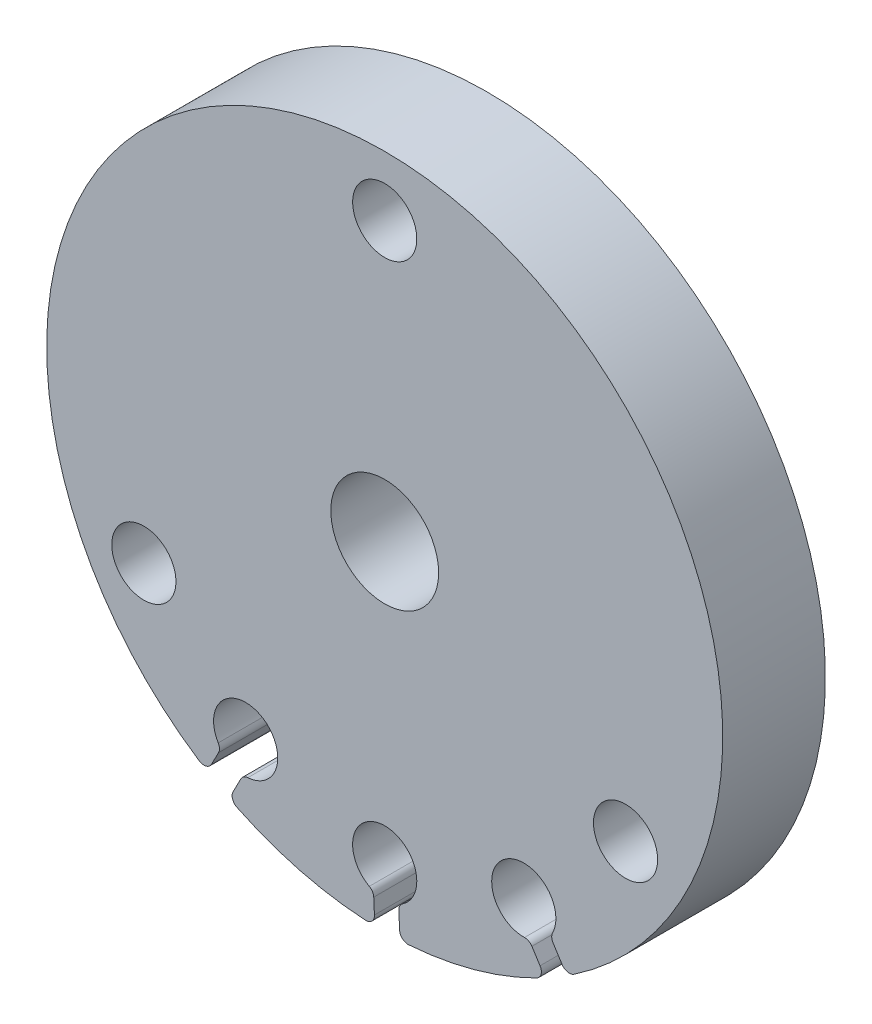
ISO-10303-21;
HEADER;
FILE_DESCRIPTION(('STEP AP214'),'2;1');
FILE_NAME('part.step','',(''),(''),'','','');
FILE_SCHEMA(('AUTOMOTIVE_DESIGN { 1 0 10303 214 1 1 1 1 }'));
ENDSEC;
DATA;
#1=APPLICATION_CONTEXT('core data for automotive mechanical design processes');
#2=APPLICATION_PROTOCOL_DEFINITION('international standard','automotive_design',2000,#1);
#3=PRODUCT_CONTEXT('',#1,'mechanical');
#4=PRODUCT('Part','Part','',(#3));
#5=PRODUCT_RELATED_PRODUCT_CATEGORY('part','',(#4));
#6=PRODUCT_DEFINITION_FORMATION('','',#4);
#7=PRODUCT_DEFINITION_CONTEXT('part definition',#1,'design');
#8=PRODUCT_DEFINITION('design','',#6,#7);
#9=PRODUCT_DEFINITION_SHAPE('','',#8);
#10=(LENGTH_UNIT() NAMED_UNIT(*) SI_UNIT(.MILLI.,.METRE.));
#11=(NAMED_UNIT(*) PLANE_ANGLE_UNIT() SI_UNIT($,.RADIAN.));
#12=(NAMED_UNIT(*) SI_UNIT($,.STERADIAN.) SOLID_ANGLE_UNIT());
#13=UNCERTAINTY_MEASURE_WITH_UNIT(LENGTH_MEASURE(1.E-05),#10,'distance_accuracy_value','');
#14=(GEOMETRIC_REPRESENTATION_CONTEXT(3) GLOBAL_UNCERTAINTY_ASSIGNED_CONTEXT((#13)) GLOBAL_UNIT_ASSIGNED_CONTEXT((#10,
#11,#12)) REPRESENTATION_CONTEXT('',''));
#15=CARTESIAN_POINT('',(0.,0.,0.));
#16=DIRECTION('',(0.,0.,1.));
#17=DIRECTION('',(1.,0.,0.));
#18=AXIS2_PLACEMENT_3D('',#15,#16,#17);
#19=CARTESIAN_POINT('',(0.,0.,6.));
#20=DIRECTION('',(0.,0.,-1.));
#21=DIRECTION('',(-1.,0.,0.));
#22=AXIS2_PLACEMENT_3D('',#19,#20,#21);
#23=CYLINDRICAL_SURFACE('',#22,19.75);
#24=CARTESIAN_POINT('',(0.,0.,6.));
#25=DIRECTION('',(0.,0.,1.));
#26=DIRECTION('',(1.,0.,0.));
#27=AXIS2_PLACEMENT_3D('',#24,#25,#26);
#28=CIRCLE('',#27,19.75);
#29=CARTESIAN_POINT('',(1.40437635482669,-19.7000057627911,6.));
#30=VERTEX_POINT('',#29);
#31=CARTESIAN_POINT('',(8.88046293036666,-17.6408582031143,6.));
#32=VERTEX_POINT('',#31);
#33=EDGE_CURVE('E284',#30,#32,#28,.T.);
#34=ORIENTED_EDGE('',*,*,#33,.F.);
#35=DIRECTION('',(0.,0.,-1.));
#36=VECTOR('',#35,1.);
#37=CARTESIAN_POINT('',(1.40437635482669,-19.7000057627911,6.));
#38=LINE('',#37,#36);
#39=CARTESIAN_POINT('',(1.40437635482669,-19.7000057627911,0.));
#40=VERTEX_POINT('',#39);
#41=EDGE_CURVE('E366',#30,#40,#38,.T.);
#42=ORIENTED_EDGE('',*,*,#41,.T.);
#43=CARTESIAN_POINT('',(0.,0.,0.));
#44=DIRECTION('',(0.,0.,1.));
#45=DIRECTION('',(1.,0.,0.));
#46=AXIS2_PLACEMENT_3D('',#43,#44,#45);
#47=CIRCLE('',#46,19.75);
#48=CARTESIAN_POINT('',(8.88046293036666,-17.6408582031143,0.));
#49=VERTEX_POINT('',#48);
#50=EDGE_CURVE('E277',#40,#49,#47,.T.);
#51=ORIENTED_EDGE('',*,*,#50,.T.);
#52=DIRECTION('',(0.,0.,-1.));
#53=VECTOR('',#52,1.);
#54=CARTESIAN_POINT('',(8.88046293036666,-17.6408582031143,6.));
#55=LINE('',#54,#53);
#56=EDGE_CURVE('E363',#49,#32,#55,.F.);
#57=ORIENTED_EDGE('',*,*,#56,.T.);
#58=EDGE_LOOP('',(#34,#42,#51,#57));
#59=FACE_BOUND('',#58,.T.);
#60=ADVANCED_FACE('F35',(#59),#23,.T.);
#61=CARTESIAN_POINT('',(-8.63377728164147,-17.7628936226903,6.));
#62=VERTEX_POINT('',#61);
#63=CARTESIAN_POINT('',(-1.1297226064935,-19.7176628136394,6.));
#64=VERTEX_POINT('',#63);
#65=EDGE_CURVE('E280',#62,#64,#28,.T.);
#66=ORIENTED_EDGE('',*,*,#65,.F.);
#67=DIRECTION('',(0.,0.,-1.));
#68=VECTOR('',#67,1.);
#69=CARTESIAN_POINT('',(-8.63377728164147,-17.7628936226903,6.));
#70=LINE('',#69,#68);
#71=CARTESIAN_POINT('',(-8.63377728164147,-17.7628936226903,0.));
#72=VERTEX_POINT('',#71);
#73=EDGE_CURVE('E351',#62,#72,#70,.T.);
#74=ORIENTED_EDGE('',*,*,#73,.T.);
#75=CARTESIAN_POINT('',(-1.1297226064935,-19.7176628136394,0.));
#76=VERTEX_POINT('',#75);
#77=EDGE_CURVE('E288',#72,#76,#47,.T.);
#78=ORIENTED_EDGE('',*,*,#77,.T.);
#79=DIRECTION('',(0.,0.,-1.));
#80=VECTOR('',#79,1.);
#81=CARTESIAN_POINT('',(-1.1297226064935,-19.7176628136394,6.));
#82=LINE('',#81,#80);
#83=EDGE_CURVE('E348',#76,#64,#82,.F.);
#84=ORIENTED_EDGE('',*,*,#83,.T.);
#85=EDGE_LOOP('',(#66,#74,#78,#84));
#86=FACE_BOUND('',#85,.T.);
#87=ADVANCED_FACE('F448',(#86),#23,.T.);
#88=CARTESIAN_POINT('',(0.,0.,6.));
#89=DIRECTION('',(0.,0.,1.));
#90=DIRECTION('',(1.,0.,0.));
#91=AXIS2_PLACEMENT_3D('',#88,#89,#90);
#92=PLANE('',#91);
#93=DIRECTION('',(0.460366494256473,0.887728951294259,0.));
#94=VECTOR('',#93,1.);
#95=CARTESIAN_POINT('',(-9.57096055519779,-15.2665723411838,6.));
#96=LINE('',#95,#94);
#97=CARTESIAN_POINT('',(-10.1189759169097,-16.3233154109231,6.));
#98=VERTEX_POINT('',#97);
#99=CARTESIAN_POINT('',(-9.71085417723536,-15.5363305011141,6.));
#100=VERTEX_POINT('',#99);
#101=EDGE_CURVE('E230',#98,#100,#96,.T.);
#102=ORIENTED_EDGE('',*,*,#101,.T.);
#103=CARTESIAN_POINT('',(-10.1547186528825,-15.3061472539858,6.));
#104=DIRECTION('',(0.,0.,1.));
#105=DIRECTION('',(1.,0.,0.));
#106=AXIS2_PLACEMENT_3D('',#103,#104,#105);
#107=CIRCLE('',#106,0.5);
#108=CARTESIAN_POINT('',(-9.72740946280193,-15.046518950304,6.));
#109=VERTEX_POINT('',#108);
#110=EDGE_CURVE('E335',#100,#109,#107,.T.);
#111=ORIENTED_EDGE('',*,*,#110,.T.);
#112=CARTESIAN_POINT('',(-8.12499999999982,-14.0729128114972,6.));
#113=DIRECTION('',(0.,0.,-1.));
#114=DIRECTION('',(-1.,0.,0.));
#115=AXIS2_PLACEMENT_3D('',#112,#113,#114);
#116=CIRCLE('',#115,1.875);
#117=CARTESIAN_POINT('',(-7.99759924504878,-15.9435795502933,6.));
#118=VERTEX_POINT('',#117);
#119=EDGE_CURVE('E218',#109,#118,#116,.T.);
#120=ORIENTED_EDGE('',*,*,#119,.T.);
#121=CARTESIAN_POINT('',(-7.96362571039517,-16.4424240139722,6.));
#122=DIRECTION('',(0.,0.,1.));
#123=DIRECTION('',(1.,0.,0.));
#124=AXIS2_PLACEMENT_3D('',#121,#122,#123);
#125=CIRCLE('',#124,0.5);
#126=CARTESIAN_POINT('',(-8.4074901860423,-16.212240766844,6.));
#127=VERTEX_POINT('',#126);
#128=EDGE_CURVE('E331',#118,#127,#125,.T.);
#129=ORIENTED_EDGE('',*,*,#128,.T.);
#130=DIRECTION('',(-0.460366494256471,-0.88772895129426,0.));
#131=VECTOR('',#130,1.);
#132=CARTESIAN_POINT('',(-9.37153610399585,-18.0712193902267,6.));
#133=LINE('',#132,#131);
#134=CARTESIAN_POINT('',(-8.85906511724705,-17.0830168661269,6.));
#135=VERTEX_POINT('',#134);
#136=EDGE_CURVE('E243',#127,#135,#133,.T.);
#137=ORIENTED_EDGE('',*,*,#136,.T.);
#138=CARTESIAN_POINT('',(-8.41520064159992,-17.3132001132551,6.));
#139=DIRECTION('',(0.,0.,1.));
#140=DIRECTION('',(1.,0.,0.));
#141=AXIS2_PLACEMENT_3D('',#138,#139,#140);
#142=CIRCLE('',#141,0.5);
#143=EDGE_CURVE('E329',#135,#62,#142,.T.);
#144=ORIENTED_EDGE('',*,*,#143,.T.);
#145=ORIENTED_EDGE('',*,*,#65,.T.);
#146=CARTESIAN_POINT('',(-1.1011220341772,-19.2184814765852,6.));
#147=DIRECTION('',(0.,0.,1.));
#148=DIRECTION('',(1.,0.,0.));
#149=AXIS2_PLACEMENT_3D('',#146,#147,#148);
#150=CIRCLE('',#149,0.5);
#151=CARTESIAN_POINT('',(-0.601632498865212,-19.1958937783003,6.));
#152=VERTEX_POINT('',#151);
#153=EDGE_CURVE('E322',#64,#152,#150,.T.);
#154=ORIENTED_EDGE('',*,*,#153,.T.);
#155=DIRECTION('',(-0.0451753965698361,0.998979070623984,0.));
#156=VECTOR('',#155,1.);
#157=CARTESIAN_POINT('',(-0.655408808828178,-18.0067197537769,6.));
#158=LINE('',#157,#156);
#159=CARTESIAN_POINT('',(-0.641681159375001,-18.3102839841736,6.));
#160=VERTEX_POINT('',#159);
#161=EDGE_CURVE('E425',#152,#160,#158,.T.);
#162=ORIENTED_EDGE('',*,*,#161,.T.);
#163=CARTESIAN_POINT('',(-1.14117069468699,-18.3328716824585,6.));
#164=DIRECTION('',(0.,0.,1.));
#165=DIRECTION('',(1.,0.,0.));
#166=AXIS2_PLACEMENT_3D('',#163,#164,#165);
#167=CIRCLE('',#166,0.5);
#168=CARTESIAN_POINT('',(-0.900924232647627,-17.8943723808883,6.));
#169=VERTEX_POINT('',#168);
#170=EDGE_CURVE('E57',#160,#169,#167,.T.);
#171=ORIENTED_EDGE('',*,*,#170,.T.);
#172=CARTESIAN_POINT('',(0.,-16.25,6.));
#173=DIRECTION('',(0.,0.,-1.));
#174=DIRECTION('',(-1.,0.,0.));
#175=AXIS2_PLACEMENT_3D('',#172,#173,#174);
#176=CIRCLE('',#175,1.875);
#177=CARTESIAN_POINT('',(1.04566565964712,-17.8063445403364,6.));
#178=VERTEX_POINT('',#177);
#179=EDGE_CURVE('E428',#169,#178,#176,.T.);
#180=ORIENTED_EDGE('',*,*,#179,.T.);
#181=CARTESIAN_POINT('',(1.32450983555302,-18.2213697510927,6.));
#182=DIRECTION('',(0.,0.,1.));
#183=DIRECTION('',(1.,0.,0.));
#184=AXIS2_PLACEMENT_3D('',#181,#182,#183);
#185=CIRCLE('',#184,0.5);
#186=CARTESIAN_POINT('',(0.825020300241031,-18.2439574493776,6.));
#187=VERTEX_POINT('',#186);
#188=EDGE_CURVE('E327',#178,#187,#185,.T.);
#189=ORIENTED_EDGE('',*,*,#188,.T.);
#190=DIRECTION('',(0.045175396569838,-0.998979070623984,0.));
#191=VECTOR('',#190,1.);
#192=CARTESIAN_POINT('',(0.919621356569918,-20.3359031212962,6.));
#193=LINE('',#192,#191);
#194=CARTESIAN_POINT('',(0.869332987746934,-19.2238591379674,6.));
#195=VERTEX_POINT('',#194);
#196=EDGE_CURVE('E232',#187,#195,#193,.T.);
#197=ORIENTED_EDGE('',*,*,#196,.T.);
#198=CARTESIAN_POINT('',(1.36882252305893,-19.2012714396825,6.));
#199=DIRECTION('',(0.,0.,1.));
#200=DIRECTION('',(1.,0.,0.));
#201=AXIS2_PLACEMENT_3D('',#198,#199,#200);
#202=CIRCLE('',#201,0.5);
#203=EDGE_CURVE('E325',#195,#30,#202,.T.);
#204=ORIENTED_EDGE('',*,*,#203,.T.);
#205=ORIENTED_EDGE('',*,*,#33,.T.);
#206=CARTESIAN_POINT('',(8.65564108402826,-17.1942541979721,6.));
#207=DIRECTION('',(0.,0.,1.));
#208=DIRECTION('',(1.,0.,0.));
#209=AXIS2_PLACEMENT_3D('',#206,#207,#208);
#210=CIRCLE('',#209,0.5);
#211=CARTESIAN_POINT('',(9.07691786139044,-16.9249479097883,6.));
#212=VERTEX_POINT('',#211);
#213=EDGE_CURVE('E318',#32,#212,#210,.T.);
#214=ORIENTED_EDGE('',*,*,#213,.T.);
#215=DIRECTION('',(-0.538612576367593,0.842553554724365,0.));
#216=VECTOR('',#215,1.);
#217=CARTESIAN_POINT('',(8.43575919857897,-15.9219811500121,6.));
#218=LINE('',#217,#216);
#219=CARTESIAN_POINT('',(8.59942980693793,-16.1780116604891,6.));
#220=VERTEX_POINT('',#219);
#221=EDGE_CURVE('E256',#212,#220,#218,.T.);
#222=ORIENTED_EDGE('',*,*,#221,.T.);
#223=CARTESIAN_POINT('',(8.17815302957575,-16.4473179486729,6.));
#224=DIRECTION('',(0.,0.,1.));
#225=DIRECTION('',(1.,0.,0.));
#226=AXIS2_PLACEMENT_3D('',#223,#224,#225);
#227=CIRCLE('',#226,0.5);
#228=CARTESIAN_POINT('',(8.16696291808612,-15.9474431829517,6.));
#229=VERTEX_POINT('',#228);
#230=EDGE_CURVE('E320',#220,#229,#227,.T.);
#231=ORIENTED_EDGE('',*,*,#230,.T.);
#232=CARTESIAN_POINT('',(8.12500000000001,-14.0729128114971,6.));
#233=DIRECTION('',(0.,0.,-1.));
#234=DIRECTION('',(-1.,0.,0.));
#235=AXIS2_PLACEMENT_3D('',#232,#233,#234);
#236=CIRCLE('',#235,1.875);
#237=CARTESIAN_POINT('',(9.80874529528752,-14.8979138906462,6.));
#238=VERTEX_POINT('',#237);
#239=EDGE_CURVE('E259',#229,#238,#236,.T.);
#240=ORIENTED_EDGE('',*,*,#239,.T.);
#241=CARTESIAN_POINT('',(10.2577440406975,-15.1179141784193,6.));
#242=DIRECTION('',(0.,0.,1.));
#243=DIRECTION('',(1.,0.,0.));
#244=AXIS2_PLACEMENT_3D('',#241,#242,#243);
#245=CIRCLE('',#244,0.5);
#246=CARTESIAN_POINT('',(9.83646726333534,-15.3872204666031,6.));
#247=VERTEX_POINT('',#246);
#248=EDGE_CURVE('E316',#238,#247,#245,.T.);
#249=ORIENTED_EDGE('',*,*,#248,.T.);
#250=DIRECTION('',(0.538612576367592,-0.842553554724366,0.));
#251=VECTOR('',#250,1.);
#252=CARTESIAN_POINT('',(10.9643670173004,-17.1515980336568,6.));
#253=LINE('',#252,#251);
#254=CARTESIAN_POINT('',(10.3647940207203,-16.21368387838,6.));
#255=VERTEX_POINT('',#254);
#256=EDGE_CURVE('E263',#247,#255,#253,.T.);
#257=ORIENTED_EDGE('',*,*,#256,.T.);
#258=CARTESIAN_POINT('',(10.7860707980825,-15.9443775901962,6.));
#259=DIRECTION('',(0.,0.,1.));
#260=DIRECTION('',(1.,0.,0.));
#261=AXIS2_PLACEMENT_3D('',#258,#259,#260);
#262=CIRCLE('',#261,0.5);
#263=CARTESIAN_POINT('',(11.0662284811496,-16.3585172678637,6.));
#264=VERTEX_POINT('',#263);
#265=EDGE_CURVE('E314',#255,#264,#262,.T.);
#266=ORIENTED_EDGE('',*,*,#265,.T.);
#267=CARTESIAN_POINT('',(-10.8371998832726,-16.5111355966207,6.));
#268=VERTEX_POINT('',#267);
#269=EDGE_CURVE('E283',#264,#268,#28,.T.);
#270=ORIENTED_EDGE('',*,*,#269,.T.);
#271=CARTESIAN_POINT('',(-10.5628403925569,-16.0931321637949,6.));
#272=DIRECTION('',(0.,0.,1.));
#273=DIRECTION('',(1.,0.,0.));
#274=AXIS2_PLACEMENT_3D('',#271,#272,#273);
#275=CIRCLE('',#274,0.5);
#276=EDGE_CURVE('E333',#268,#98,#275,.T.);
#277=ORIENTED_EDGE('',*,*,#276,.T.);
#278=EDGE_LOOP('',(#102,#111,#120,#129,#137,#144,#145,#154,#162,#171,#180,#189,#197,#204,#205,
#214,#222,#231,#240,#249,#257,#266,#270,#277));
#279=FACE_BOUND('',#278,.T.);
#280=CARTESIAN_POINT('',(-14.072912811497,-8.12500000000017,6.));
#281=DIRECTION('',(0.,0.,-1.));
#282=DIRECTION('',(-1.,0.,0.));
#283=AXIS2_PLACEMENT_3D('',#280,#281,#282);
#284=CIRCLE('',#283,1.875);
#285=CARTESIAN_POINT('',(-15.947912811497,-8.12500000000017,6.));
#286=VERTEX_POINT('',#285);
#287=EDGE_CURVE('E236',#286,#286,#284,.T.);
#288=ORIENTED_EDGE('',*,*,#287,.T.);
#289=EDGE_LOOP('',(#288));
#290=FACE_BOUND('',#289,.T.);
#291=CARTESIAN_POINT('',(-1.13473143512402E-13,16.25,6.));
#292=DIRECTION('',(0.,0.,-1.));
#293=DIRECTION('',(-1.,0.,0.));
#294=AXIS2_PLACEMENT_3D('',#291,#292,#293);
#295=CIRCLE('',#294,1.875);
#296=CARTESIAN_POINT('',(-1.87500000000011,16.25,6.));
#297=VERTEX_POINT('',#296);
#298=EDGE_CURVE('E244',#297,#297,#295,.T.);
#299=ORIENTED_EDGE('',*,*,#298,.T.);
#300=EDGE_LOOP('',(#299));
#301=FACE_BOUND('',#300,.T.);
#302=CARTESIAN_POINT('',(14.0729128114971,-8.12499999999997,6.));
#303=DIRECTION('',(0.,0.,-1.));
#304=DIRECTION('',(-1.,0.,0.));
#305=AXIS2_PLACEMENT_3D('',#302,#303,#304);
#306=CIRCLE('',#305,1.875);
#307=CARTESIAN_POINT('',(12.1979128114971,-8.12499999999997,6.));
#308=VERTEX_POINT('',#307);
#309=EDGE_CURVE('E250',#308,#308,#306,.T.);
#310=ORIENTED_EDGE('',*,*,#309,.T.);
#311=EDGE_LOOP('',(#310));
#312=FACE_BOUND('',#311,.T.);
#313=CARTESIAN_POINT('',(0.,0.,6.));
#314=DIRECTION('',(0.,0.,1.));
#315=DIRECTION('',(1.,0.,0.));
#316=AXIS2_PLACEMENT_3D('',#313,#314,#315);
#317=CIRCLE('',#316,3.15);
#318=CARTESIAN_POINT('',(3.15,0.,6.));
#319=VERTEX_POINT('',#318);
#320=EDGE_CURVE('E274',#319,#319,#317,.T.);
#321=ORIENTED_EDGE('',*,*,#320,.F.);
#322=EDGE_LOOP('',(#321));
#323=FACE_BOUND('',#322,.T.);
#324=ADVANCED_FACE('F390',(#279,#290,#301,#312,#323),#92,.T.);
#325=CARTESIAN_POINT('',(0.,0.,0.));
#326=DIRECTION('',(0.,0.,1.));
#327=DIRECTION('',(1.,0.,0.));
#328=AXIS2_PLACEMENT_3D('',#325,#326,#327);
#329=PLANE('',#328);
#330=CARTESIAN_POINT('',(-14.072912811497,-8.12500000000017,0.));
#331=DIRECTION('',(0.,0.,-1.));
#332=DIRECTION('',(-1.,0.,0.));
#333=AXIS2_PLACEMENT_3D('',#330,#331,#332);
#334=CIRCLE('',#333,1.875);
#335=CARTESIAN_POINT('',(-15.947912811497,-8.12500000000017,0.));
#336=VERTEX_POINT('',#335);
#337=EDGE_CURVE('E240',#336,#336,#334,.T.);
#338=ORIENTED_EDGE('',*,*,#337,.F.);
#339=EDGE_LOOP('',(#338));
#340=FACE_BOUND('',#339,.T.);
#341=CARTESIAN_POINT('',(-1.13473143512402E-13,16.25,0.));
#342=DIRECTION('',(0.,0.,-1.));
#343=DIRECTION('',(-1.,0.,0.));
#344=AXIS2_PLACEMENT_3D('',#341,#342,#343);
#345=CIRCLE('',#344,1.875);
#346=CARTESIAN_POINT('',(-1.87500000000011,16.25,0.));
#347=VERTEX_POINT('',#346);
#348=EDGE_CURVE('E239',#347,#347,#345,.T.);
#349=ORIENTED_EDGE('',*,*,#348,.F.);
#350=EDGE_LOOP('',(#349));
#351=FACE_BOUND('',#350,.T.);
#352=CARTESIAN_POINT('',(14.0729128114971,-8.12499999999997,0.));
#353=DIRECTION('',(0.,0.,-1.));
#354=DIRECTION('',(-1.,0.,0.));
#355=AXIS2_PLACEMENT_3D('',#352,#353,#354);
#356=CIRCLE('',#355,1.875);
#357=CARTESIAN_POINT('',(12.1979128114971,-8.12499999999997,0.));
#358=VERTEX_POINT('',#357);
#359=EDGE_CURVE('E247',#358,#358,#356,.T.);
#360=ORIENTED_EDGE('',*,*,#359,.F.);
#361=EDGE_LOOP('',(#360));
#362=FACE_BOUND('',#361,.T.);
#363=CARTESIAN_POINT('',(-8.12499999999982,-14.0729128114972,0.));
#364=DIRECTION('',(0.,0.,-1.));
#365=DIRECTION('',(-1.,0.,0.));
#366=AXIS2_PLACEMENT_3D('',#363,#364,#365);
#367=CIRCLE('',#366,1.875);
#368=CARTESIAN_POINT('',(-9.72740946280193,-15.046518950304,0.));
#369=VERTEX_POINT('',#368);
#370=CARTESIAN_POINT('',(-7.99759924504878,-15.9435795502933,0.));
#371=VERTEX_POINT('',#370);
#372=EDGE_CURVE('E215',#369,#371,#367,.T.);
#373=ORIENTED_EDGE('',*,*,#372,.F.);
#374=CARTESIAN_POINT('',(-10.1547186528825,-15.3061472539858,0.));
#375=DIRECTION('',(0.,0.,1.));
#376=DIRECTION('',(1.,0.,0.));
#377=AXIS2_PLACEMENT_3D('',#374,#375,#376);
#378=CIRCLE('',#377,0.5);
#379=CARTESIAN_POINT('',(-9.71085417723536,-15.5363305011141,0.));
#380=VERTEX_POINT('',#379);
#381=EDGE_CURVE('E198',#369,#380,#378,.F.);
#382=ORIENTED_EDGE('',*,*,#381,.T.);
#383=DIRECTION('',(0.460366494256473,0.887728951294259,0.));
#384=VECTOR('',#383,1.);
#385=CARTESIAN_POINT('',(-9.57096055519779,-15.2665723411838,0.));
#386=LINE('',#385,#384);
#387=CARTESIAN_POINT('',(-10.1189759169097,-16.3233154109231,0.));
#388=VERTEX_POINT('',#387);
#389=EDGE_CURVE('E227',#388,#380,#386,.T.);
#390=ORIENTED_EDGE('',*,*,#389,.F.);
#391=CARTESIAN_POINT('',(-10.5628403925569,-16.0931321637949,0.));
#392=DIRECTION('',(0.,0.,1.));
#393=DIRECTION('',(1.,0.,0.));
#394=AXIS2_PLACEMENT_3D('',#391,#392,#393);
#395=CIRCLE('',#394,0.5);
#396=CARTESIAN_POINT('',(-10.8371998832726,-16.5111355966207,0.));
#397=VERTEX_POINT('',#396);
#398=EDGE_CURVE('E209',#388,#397,#395,.F.);
#399=ORIENTED_EDGE('',*,*,#398,.T.);
#400=CARTESIAN_POINT('',(11.0662284811496,-16.3585172678637,0.));
#401=VERTEX_POINT('',#400);
#402=EDGE_CURVE('E285',#401,#397,#47,.T.);
#403=ORIENTED_EDGE('',*,*,#402,.F.);
#404=CARTESIAN_POINT('',(10.7860707980825,-15.9443775901962,0.));
#405=DIRECTION('',(0.,0.,1.));
#406=DIRECTION('',(1.,0.,0.));
#407=AXIS2_PLACEMENT_3D('',#404,#405,#406);
#408=CIRCLE('',#407,0.5);
#409=CARTESIAN_POINT('',(10.3647940207203,-16.21368387838,0.));
#410=VERTEX_POINT('',#409);
#411=EDGE_CURVE('E219',#401,#410,#408,.F.);
#412=ORIENTED_EDGE('',*,*,#411,.T.);
#413=DIRECTION('',(0.538612576367592,-0.842553554724366,0.));
#414=VECTOR('',#413,1.);
#415=CARTESIAN_POINT('',(10.9643670173004,-17.1515980336568,0.));
#416=LINE('',#415,#414);
#417=CARTESIAN_POINT('',(9.83646726333534,-15.3872204666031,0.));
#418=VERTEX_POINT('',#417);
#419=EDGE_CURVE('E260',#418,#410,#416,.T.);
#420=ORIENTED_EDGE('',*,*,#419,.F.);
#421=CARTESIAN_POINT('',(10.2577440406975,-15.1179141784193,0.));
#422=DIRECTION('',(0.,0.,1.));
#423=DIRECTION('',(1.,0.,0.));
#424=AXIS2_PLACEMENT_3D('',#421,#422,#423);
#425=CIRCLE('',#424,0.5);
#426=CARTESIAN_POINT('',(9.80874529528752,-14.8979138906462,0.));
#427=VERTEX_POINT('',#426);
#428=EDGE_CURVE('E294',#418,#427,#425,.F.);
#429=ORIENTED_EDGE('',*,*,#428,.T.);
#430=CARTESIAN_POINT('',(8.12500000000001,-14.0729128114971,0.));
#431=DIRECTION('',(0.,0.,-1.));
#432=DIRECTION('',(-1.,0.,0.));
#433=AXIS2_PLACEMENT_3D('',#430,#431,#432);
#434=CIRCLE('',#433,1.875);
#435=CARTESIAN_POINT('',(8.16696291808612,-15.9474431829517,0.));
#436=VERTEX_POINT('',#435);
#437=EDGE_CURVE('E269',#436,#427,#434,.T.);
#438=ORIENTED_EDGE('',*,*,#437,.F.);
#439=CARTESIAN_POINT('',(8.17815302957575,-16.4473179486729,0.));
#440=DIRECTION('',(0.,0.,1.));
#441=DIRECTION('',(1.,0.,0.));
#442=AXIS2_PLACEMENT_3D('',#439,#440,#441);
#443=CIRCLE('',#442,0.5);
#444=CARTESIAN_POINT('',(8.59942980693793,-16.1780116604891,0.));
#445=VERTEX_POINT('',#444);
#446=EDGE_CURVE('E298',#436,#445,#443,.F.);
#447=ORIENTED_EDGE('',*,*,#446,.T.);
#448=DIRECTION('',(-0.538612576367593,0.842553554724365,0.));
#449=VECTOR('',#448,1.);
#450=CARTESIAN_POINT('',(8.43575919857897,-15.9219811500121,0.));
#451=LINE('',#450,#449);
#452=CARTESIAN_POINT('',(9.07691786139044,-16.9249479097883,0.));
#453=VERTEX_POINT('',#452);
#454=EDGE_CURVE('E253',#453,#445,#451,.T.);
#455=ORIENTED_EDGE('',*,*,#454,.F.);
#456=CARTESIAN_POINT('',(8.65564108402826,-17.1942541979721,0.));
#457=DIRECTION('',(0.,0.,1.));
#458=DIRECTION('',(1.,0.,0.));
#459=AXIS2_PLACEMENT_3D('',#456,#457,#458);
#460=CIRCLE('',#459,0.5);
#461=EDGE_CURVE('E296',#453,#49,#460,.F.);
#462=ORIENTED_EDGE('',*,*,#461,.T.);
#463=ORIENTED_EDGE('',*,*,#50,.F.);
#464=CARTESIAN_POINT('',(1.36882252305893,-19.2012714396825,0.));
#465=DIRECTION('',(0.,0.,1.));
#466=DIRECTION('',(1.,0.,0.));
#467=AXIS2_PLACEMENT_3D('',#464,#465,#466);
#468=CIRCLE('',#467,0.5);
#469=CARTESIAN_POINT('',(0.869332987746934,-19.2238591379674,0.));
#470=VERTEX_POINT('',#469);
#471=EDGE_CURVE('E304',#40,#470,#468,.F.);
#472=ORIENTED_EDGE('',*,*,#471,.T.);
#473=DIRECTION('',(0.045175396569838,-0.998979070623984,0.));
#474=VECTOR('',#473,1.);
#475=CARTESIAN_POINT('',(0.919621356569918,-20.3359031212962,0.));
#476=LINE('',#475,#474);
#477=CARTESIAN_POINT('',(0.825020300241031,-18.2439574493776,0.));
#478=VERTEX_POINT('',#477);
#479=EDGE_CURVE('E420',#478,#470,#476,.T.);
#480=ORIENTED_EDGE('',*,*,#479,.F.);
#481=CARTESIAN_POINT('',(1.32450983555302,-18.2213697510927,0.));
#482=DIRECTION('',(0.,0.,1.));
#483=DIRECTION('',(1.,0.,0.));
#484=AXIS2_PLACEMENT_3D('',#481,#482,#483);
#485=CIRCLE('',#484,0.5);
#486=CARTESIAN_POINT('',(1.04566565964712,-17.8063445403364,0.));
#487=VERTEX_POINT('',#486);
#488=EDGE_CURVE('E306',#478,#487,#485,.F.);
#489=ORIENTED_EDGE('',*,*,#488,.T.);
#490=CARTESIAN_POINT('',(0.,-16.25,0.));
#491=DIRECTION('',(0.,0.,-1.));
#492=DIRECTION('',(-1.,0.,0.));
#493=AXIS2_PLACEMENT_3D('',#490,#491,#492);
#494=CIRCLE('',#493,1.875);
#495=CARTESIAN_POINT('',(-0.900924232647627,-17.8943723808883,0.));
#496=VERTEX_POINT('',#495);
#497=EDGE_CURVE('E426',#496,#487,#494,.T.);
#498=ORIENTED_EDGE('',*,*,#497,.F.);
#499=CARTESIAN_POINT('',(-1.14117069468699,-18.3328716824585,0.));
#500=DIRECTION('',(0.,0.,1.));
#501=DIRECTION('',(1.,0.,0.));
#502=AXIS2_PLACEMENT_3D('',#499,#500,#501);
#503=CIRCLE('',#502,0.5);
#504=CARTESIAN_POINT('',(-0.641681159375001,-18.3102839841736,0.));
#505=VERTEX_POINT('',#504);
#506=EDGE_CURVE('E302',#496,#505,#503,.F.);
#507=ORIENTED_EDGE('',*,*,#506,.T.);
#508=DIRECTION('',(0.0451753965698361,-0.998979070623984,0.));
#509=VECTOR('',#508,1.);
#510=CARTESIAN_POINT('',(-1.4667014596142,-0.066326534795411,0.));
#511=LINE('',#510,#509);
#512=CARTESIAN_POINT('',(-0.601632498865212,-19.1958937783003,0.));
#513=VERTEX_POINT('',#512);
#514=EDGE_CURVE('E289',#505,#513,#511,.T.);
#515=ORIENTED_EDGE('',*,*,#514,.T.);
#516=CARTESIAN_POINT('',(-1.1011220341772,-19.2184814765852,0.));
#517=DIRECTION('',(0.,0.,1.));
#518=DIRECTION('',(1.,0.,0.));
#519=AXIS2_PLACEMENT_3D('',#516,#517,#518);
#520=CIRCLE('',#519,0.5);
#521=EDGE_CURVE('E300',#513,#76,#520,.F.);
#522=ORIENTED_EDGE('',*,*,#521,.T.);
#523=ORIENTED_EDGE('',*,*,#77,.F.);
#524=CARTESIAN_POINT('',(-8.41520064159992,-17.3132001132551,0.));
#525=DIRECTION('',(0.,0.,1.));
#526=DIRECTION('',(1.,0.,0.));
#527=AXIS2_PLACEMENT_3D('',#524,#525,#526);
#528=CIRCLE('',#527,0.5);
#529=CARTESIAN_POINT('',(-8.85906511724705,-17.0830168661269,0.));
#530=VERTEX_POINT('',#529);
#531=EDGE_CURVE('E308',#72,#530,#528,.F.);
#532=ORIENTED_EDGE('',*,*,#531,.T.);
#533=DIRECTION('',(-0.460366494256471,-0.88772895129426,0.));
#534=VECTOR('',#533,1.);
#535=CARTESIAN_POINT('',(-9.37153610399585,-18.0712193902267,0.));
#536=LINE('',#535,#534);
#537=CARTESIAN_POINT('',(-8.4074901860423,-16.212240766844,0.));
#538=VERTEX_POINT('',#537);
#539=EDGE_CURVE('E226',#538,#530,#536,.T.);
#540=ORIENTED_EDGE('',*,*,#539,.F.);
#541=CARTESIAN_POINT('',(-7.96362571039517,-16.4424240139722,0.));
#542=DIRECTION('',(0.,0.,1.));
#543=DIRECTION('',(1.,0.,0.));
#544=AXIS2_PLACEMENT_3D('',#541,#542,#543);
#545=CIRCLE('',#544,0.5);
#546=EDGE_CURVE('E225',#538,#371,#545,.F.);
#547=ORIENTED_EDGE('',*,*,#546,.T.);
#548=EDGE_LOOP('',(#373,#382,#390,#399,#403,#412,#420,#429,#438,#447,#455,#462,#463,#472,#480,
#489,#498,#507,#515,#522,#523,#532,#540,#547));
#549=FACE_BOUND('',#548,.T.);
#550=CARTESIAN_POINT('',(0.,0.,0.));
#551=DIRECTION('',(0.,0.,1.));
#552=DIRECTION('',(1.,0.,0.));
#553=AXIS2_PLACEMENT_3D('',#550,#551,#552);
#554=CIRCLE('',#553,3.15);
#555=CARTESIAN_POINT('',(3.15,0.,0.));
#556=VERTEX_POINT('',#555);
#557=EDGE_CURVE('E266',#556,#556,#554,.T.);
#558=ORIENTED_EDGE('',*,*,#557,.T.);
#559=EDGE_LOOP('',(#558));
#560=FACE_BOUND('',#559,.T.);
#561=ADVANCED_FACE('F222',(#340,#351,#362,#549,#560),#329,.F.);
#562=ORIENTED_EDGE('',*,*,#402,.T.);
#563=DIRECTION('',(0.,0.,-1.));
#564=VECTOR('',#563,1.);
#565=CARTESIAN_POINT('',(-10.8371998832726,-16.5111355966207,6.));
#566=LINE('',#565,#564);
#567=EDGE_CURVE('E340',#397,#268,#566,.F.);
#568=ORIENTED_EDGE('',*,*,#567,.T.);
#569=ORIENTED_EDGE('',*,*,#269,.F.);
#570=DIRECTION('',(0.,0.,-1.));
#571=VECTOR('',#570,1.);
#572=CARTESIAN_POINT('',(11.0662284811496,-16.3585172678637,6.));
#573=LINE('',#572,#571);
#574=EDGE_CURVE('E337',#264,#401,#573,.T.);
#575=ORIENTED_EDGE('',*,*,#574,.T.);
#576=EDGE_LOOP('',(#562,#568,#569,#575));
#577=FACE_BOUND('',#576,.T.);
#578=ADVANCED_FACE('F398',(#577),#23,.T.);
#579=CARTESIAN_POINT('',(0.,0.,6.));
#580=DIRECTION('',(0.,0.,-1.));
#581=DIRECTION('',(-1.,0.,0.));
#582=AXIS2_PLACEMENT_3D('',#579,#580,#581);
#583=CYLINDRICAL_SURFACE('',#582,3.15);
#584=ORIENTED_EDGE('',*,*,#320,.T.);
#585=EDGE_LOOP('',(#584));
#586=FACE_BOUND('',#585,.T.);
#587=ORIENTED_EDGE('',*,*,#557,.F.);
#588=EDGE_LOOP('',(#587));
#589=FACE_BOUND('',#588,.T.);
#590=ADVANCED_FACE('F484',(#586,#589),#583,.F.);
#591=CARTESIAN_POINT('',(10.9643670173004,-17.1515980336568,6.));
#592=DIRECTION('',(0.842553554724366,0.538612576367592,0.));
#593=DIRECTION('',(-0.538612576367592,0.842553554724366,0.));
#594=AXIS2_PLACEMENT_3D('',#591,#592,#593);
#595=PLANE('',#594);
#596=ORIENTED_EDGE('',*,*,#256,.F.);
#597=DIRECTION('',(0.,0.,-1.));
#598=VECTOR('',#597,1.);
#599=CARTESIAN_POINT('',(9.83646726333534,-15.3872204666031,6.));
#600=LINE('',#599,#598);
#601=EDGE_CURVE('E11',#247,#418,#600,.T.);
#602=ORIENTED_EDGE('',*,*,#601,.T.);
#603=ORIENTED_EDGE('',*,*,#419,.T.);
#604=DIRECTION('',(0.,0.,-1.));
#605=VECTOR('',#604,1.);
#606=CARTESIAN_POINT('',(10.3647940207203,-16.21368387838,6.));
#607=LINE('',#606,#605);
#608=EDGE_CURVE('E43',#410,#255,#607,.F.);
#609=ORIENTED_EDGE('',*,*,#608,.T.);
#610=EDGE_LOOP('',(#596,#602,#603,#609));
#611=FACE_BOUND('',#610,.T.);
#612=ADVANCED_FACE('F384',(#611),#595,.F.);
#613=CARTESIAN_POINT('',(8.43575919857897,-15.9219811500121,6.));
#614=DIRECTION('',(-0.842553554724365,-0.538612576367593,0.));
#615=DIRECTION('',(0.538612576367593,-0.842553554724366,0.));
#616=AXIS2_PLACEMENT_3D('',#613,#614,#615);
#617=PLANE('',#616);
#618=ORIENTED_EDGE('',*,*,#454,.T.);
#619=DIRECTION('',(0.,0.,-1.));
#620=VECTOR('',#619,1.);
#621=CARTESIAN_POINT('',(8.59942980693793,-16.1780116604891,6.));
#622=LINE('',#621,#620);
#623=EDGE_CURVE('E380',#445,#220,#622,.F.);
#624=ORIENTED_EDGE('',*,*,#623,.T.);
#625=ORIENTED_EDGE('',*,*,#221,.F.);
#626=DIRECTION('',(0.,0.,-1.));
#627=VECTOR('',#626,1.);
#628=CARTESIAN_POINT('',(9.07691786139044,-16.9249479097883,6.));
#629=LINE('',#628,#627);
#630=EDGE_CURVE('E378',#212,#453,#629,.T.);
#631=ORIENTED_EDGE('',*,*,#630,.T.);
#632=EDGE_LOOP('',(#618,#624,#625,#631));
#633=FACE_BOUND('',#632,.T.);
#634=ADVANCED_FACE('F457',(#633),#617,.F.);
#635=CARTESIAN_POINT('',(8.12500000000001,-14.0729128114971,6.));
#636=DIRECTION('',(0.,0.,-1.));
#637=DIRECTION('',(-1.,0.,0.));
#638=AXIS2_PLACEMENT_3D('',#635,#636,#637);
#639=CYLINDRICAL_SURFACE('',#638,1.875);
#640=ORIENTED_EDGE('',*,*,#239,.F.);
#641=DIRECTION('',(0.,0.,-1.));
#642=VECTOR('',#641,1.);
#643=CARTESIAN_POINT('',(8.16696291808612,-15.9474431829517,6.));
#644=LINE('',#643,#642);
#645=EDGE_CURVE('E375',#229,#436,#644,.T.);
#646=ORIENTED_EDGE('',*,*,#645,.T.);
#647=ORIENTED_EDGE('',*,*,#437,.T.);
#648=DIRECTION('',(0.,0.,-1.));
#649=VECTOR('',#648,1.);
#650=CARTESIAN_POINT('',(9.80874529528752,-14.8979138906462,6.));
#651=LINE('',#650,#649);
#652=EDGE_CURVE('E373',#427,#238,#651,.F.);
#653=ORIENTED_EDGE('',*,*,#652,.T.);
#654=EDGE_LOOP('',(#640,#646,#647,#653));
#655=FACE_BOUND('',#654,.T.);
#656=ADVANCED_FACE('F466',(#655),#639,.F.);
#657=CARTESIAN_POINT('',(14.0729128114971,-8.12499999999997,6.));
#658=DIRECTION('',(0.,0.,-1.));
#659=DIRECTION('',(-1.,0.,0.));
#660=AXIS2_PLACEMENT_3D('',#657,#658,#659);
#661=CYLINDRICAL_SURFACE('',#660,1.875);
#662=ORIENTED_EDGE('',*,*,#309,.F.);
#663=EDGE_LOOP('',(#662));
#664=FACE_BOUND('',#663,.T.);
#665=ORIENTED_EDGE('',*,*,#359,.T.);
#666=EDGE_LOOP('',(#665));
#667=FACE_BOUND('',#666,.T.);
#668=ADVANCED_FACE('F503',(#664,#667),#661,.F.);
#669=CARTESIAN_POINT('',(-1.13473143512402E-13,16.25,6.));
#670=DIRECTION('',(0.,0.,-1.));
#671=DIRECTION('',(-1.,0.,0.));
#672=AXIS2_PLACEMENT_3D('',#669,#670,#671);
#673=CYLINDRICAL_SURFACE('',#672,1.875);
#674=ORIENTED_EDGE('',*,*,#298,.F.);
#675=EDGE_LOOP('',(#674));
#676=FACE_BOUND('',#675,.T.);
#677=ORIENTED_EDGE('',*,*,#348,.T.);
#678=EDGE_LOOP('',(#677));
#679=FACE_BOUND('',#678,.T.);
#680=ADVANCED_FACE('F508',(#676,#679),#673,.F.);
#681=CARTESIAN_POINT('',(-14.072912811497,-8.12500000000017,6.));
#682=DIRECTION('',(0.,0.,-1.));
#683=DIRECTION('',(-1.,0.,0.));
#684=AXIS2_PLACEMENT_3D('',#681,#682,#683);
#685=CYLINDRICAL_SURFACE('',#684,1.875);
#686=ORIENTED_EDGE('',*,*,#287,.F.);
#687=EDGE_LOOP('',(#686));
#688=FACE_BOUND('',#687,.T.);
#689=ORIENTED_EDGE('',*,*,#337,.T.);
#690=EDGE_LOOP('',(#689));
#691=FACE_BOUND('',#690,.T.);
#692=ADVANCED_FACE('F512',(#688,#691),#685,.F.);
#693=CARTESIAN_POINT('',(-9.37153610399585,-18.0712193902267,6.));
#694=DIRECTION('',(0.88772895129426,-0.460366494256471,0.));
#695=DIRECTION('',(0.460366494256471,0.88772895129426,0.));
#696=AXIS2_PLACEMENT_3D('',#693,#694,#695);
#697=PLANE('',#696);
#698=ORIENTED_EDGE('',*,*,#136,.F.);
#699=DIRECTION('',(0.,0.,-1.));
#700=VECTOR('',#699,1.);
#701=CARTESIAN_POINT('',(-8.4074901860423,-16.212240766844,6.));
#702=LINE('',#701,#700);
#703=EDGE_CURVE('E345',#127,#538,#702,.T.);
#704=ORIENTED_EDGE('',*,*,#703,.T.);
#705=ORIENTED_EDGE('',*,*,#539,.T.);
#706=DIRECTION('',(0.,0.,-1.));
#707=VECTOR('',#706,1.);
#708=CARTESIAN_POINT('',(-8.85906511724705,-17.0830168661269,6.));
#709=LINE('',#708,#707);
#710=EDGE_CURVE('E343',#530,#135,#709,.F.);
#711=ORIENTED_EDGE('',*,*,#710,.T.);
#712=EDGE_LOOP('',(#698,#704,#705,#711));
#713=FACE_BOUND('',#712,.T.);
#714=ADVANCED_FACE('F516',(#713),#697,.F.);
#715=CARTESIAN_POINT('',(-9.57096055519779,-15.2665723411838,6.));
#716=DIRECTION('',(-0.887728951294259,0.460366494256473,0.));
#717=DIRECTION('',(-0.460366494256473,-0.887728951294259,0.));
#718=AXIS2_PLACEMENT_3D('',#715,#716,#717);
#719=PLANE('',#718);
#720=ORIENTED_EDGE('',*,*,#389,.T.);
#721=DIRECTION('',(0.,0.,-1.));
#722=VECTOR('',#721,1.);
#723=CARTESIAN_POINT('',(-9.71085417723536,-15.5363305011141,6.));
#724=LINE('',#723,#722);
#725=EDGE_CURVE('E203',#380,#100,#724,.F.);
#726=ORIENTED_EDGE('',*,*,#725,.T.);
#727=ORIENTED_EDGE('',*,*,#101,.F.);
#728=DIRECTION('',(0.,0.,-1.));
#729=VECTOR('',#728,1.);
#730=CARTESIAN_POINT('',(-10.1189759169097,-16.3233154109231,6.));
#731=LINE('',#730,#729);
#732=EDGE_CURVE('E208',#98,#388,#731,.T.);
#733=ORIENTED_EDGE('',*,*,#732,.T.);
#734=EDGE_LOOP('',(#720,#726,#727,#733));
#735=FACE_BOUND('',#734,.T.);
#736=ADVANCED_FACE('F518',(#735),#719,.F.);
#737=CARTESIAN_POINT('',(-8.12499999999982,-14.0729128114972,6.));
#738=DIRECTION('',(0.,0.,-1.));
#739=DIRECTION('',(-1.,0.,0.));
#740=AXIS2_PLACEMENT_3D('',#737,#738,#739);
#741=CYLINDRICAL_SURFACE('',#740,1.875);
#742=ORIENTED_EDGE('',*,*,#119,.F.);
#743=DIRECTION('',(0.,0.,-1.));
#744=VECTOR('',#743,1.);
#745=CARTESIAN_POINT('',(-9.72740946280193,-15.046518950304,6.));
#746=LINE('',#745,#744);
#747=EDGE_CURVE('E202',#109,#369,#746,.T.);
#748=ORIENTED_EDGE('',*,*,#747,.T.);
#749=ORIENTED_EDGE('',*,*,#372,.T.);
#750=DIRECTION('',(0.,0.,-1.));
#751=VECTOR('',#750,1.);
#752=CARTESIAN_POINT('',(-7.99759924504878,-15.9435795502933,6.));
#753=LINE('',#752,#751);
#754=EDGE_CURVE('E220',#371,#118,#753,.F.);
#755=ORIENTED_EDGE('',*,*,#754,.T.);
#756=EDGE_LOOP('',(#742,#748,#749,#755));
#757=FACE_BOUND('',#756,.T.);
#758=ADVANCED_FACE('F214',(#757),#741,.F.);
#759=CARTESIAN_POINT('',(0.919621356569918,-20.3359031212962,6.));
#760=DIRECTION('',(0.998979070623984,0.045175396569838,0.));
#761=DIRECTION('',(-0.045175396569838,0.998979070623984,0.));
#762=AXIS2_PLACEMENT_3D('',#759,#760,#761);
#763=PLANE('',#762);
#764=ORIENTED_EDGE('',*,*,#196,.F.);
#765=DIRECTION('',(0.,0.,-1.));
#766=VECTOR('',#765,1.);
#767=CARTESIAN_POINT('',(0.825020300241031,-18.2439574493776,6.));
#768=LINE('',#767,#766);
#769=EDGE_CURVE('E356',#187,#478,#768,.T.);
#770=ORIENTED_EDGE('',*,*,#769,.T.);
#771=ORIENTED_EDGE('',*,*,#479,.T.);
#772=DIRECTION('',(0.,0.,-1.));
#773=VECTOR('',#772,1.);
#774=CARTESIAN_POINT('',(0.869332987746934,-19.2238591379674,6.));
#775=LINE('',#774,#773);
#776=EDGE_CURVE('E354',#470,#195,#775,.F.);
#777=ORIENTED_EDGE('',*,*,#776,.T.);
#778=EDGE_LOOP('',(#764,#770,#771,#777));
#779=FACE_BOUND('',#778,.T.);
#780=ADVANCED_FACE('F423',(#779),#763,.F.);
#781=CARTESIAN_POINT('',(-0.655408808828178,-18.0067197537769,6.));
#782=DIRECTION('',(-0.998979070623984,-0.0451753965698361,0.));
#783=DIRECTION('',(0.0451753965698361,-0.998979070623984,0.));
#784=AXIS2_PLACEMENT_3D('',#781,#782,#783);
#785=PLANE('',#784);
#786=ORIENTED_EDGE('',*,*,#514,.F.);
#787=DIRECTION('',(0.,0.,-1.));
#788=VECTOR('',#787,1.);
#789=CARTESIAN_POINT('',(-0.641681159375001,-18.3102839841736,6.));
#790=LINE('',#789,#788);
#791=EDGE_CURVE('E371',#505,#160,#790,.F.);
#792=ORIENTED_EDGE('',*,*,#791,.T.);
#793=ORIENTED_EDGE('',*,*,#161,.F.);
#794=DIRECTION('',(0.,0.,-1.));
#795=VECTOR('',#794,1.);
#796=CARTESIAN_POINT('',(-0.601632498865212,-19.1958937783003,6.));
#797=LINE('',#796,#795);
#798=EDGE_CURVE('E369',#152,#513,#797,.T.);
#799=ORIENTED_EDGE('',*,*,#798,.T.);
#800=EDGE_LOOP('',(#786,#792,#793,#799));
#801=FACE_BOUND('',#800,.T.);
#802=ADVANCED_FACE('F526',(#801),#785,.F.);
#803=CARTESIAN_POINT('',(0.,-16.25,6.));
#804=DIRECTION('',(0.,0.,-1.));
#805=DIRECTION('',(-1.,0.,0.));
#806=AXIS2_PLACEMENT_3D('',#803,#804,#805);
#807=CYLINDRICAL_SURFACE('',#806,1.875);
#808=ORIENTED_EDGE('',*,*,#497,.T.);
#809=DIRECTION('',(0.,0.,-1.));
#810=VECTOR('',#809,1.);
#811=CARTESIAN_POINT('',(1.04566565964712,-17.8063445403364,6.));
#812=LINE('',#811,#810);
#813=EDGE_CURVE('E50',#487,#178,#812,.F.);
#814=ORIENTED_EDGE('',*,*,#813,.T.);
#815=ORIENTED_EDGE('',*,*,#179,.F.);
#816=DIRECTION('',(0.,0.,-1.));
#817=VECTOR('',#816,1.);
#818=CARTESIAN_POINT('',(-0.900924232647627,-17.8943723808883,6.));
#819=LINE('',#818,#817);
#820=EDGE_CURVE('E359',#169,#496,#819,.T.);
#821=ORIENTED_EDGE('',*,*,#820,.T.);
#822=EDGE_LOOP('',(#808,#814,#815,#821));
#823=FACE_BOUND('',#822,.T.);
#824=ADVANCED_FACE('F529',(#823),#807,.F.);
#825=CARTESIAN_POINT('',(-10.1547186528825,-15.3061472539858,6.));
#826=DIRECTION('',(0.,0.,-1.));
#827=DIRECTION('',(-1.,0.,0.));
#828=AXIS2_PLACEMENT_3D('',#825,#826,#827);
#829=CYLINDRICAL_SURFACE('',#828,0.5);
#830=ORIENTED_EDGE('',*,*,#110,.F.);
#831=ORIENTED_EDGE('',*,*,#725,.F.);
#832=ORIENTED_EDGE('',*,*,#381,.F.);
#833=ORIENTED_EDGE('',*,*,#747,.F.);
#834=EDGE_LOOP('',(#830,#831,#832,#833));
#835=FACE_BOUND('',#834,.T.);
#836=ADVANCED_FACE('F201',(#835),#829,.T.);
#837=CARTESIAN_POINT('',(-10.5628403925569,-16.0931321637949,6.));
#838=DIRECTION('',(0.,0.,-1.));
#839=DIRECTION('',(-1.,0.,0.));
#840=AXIS2_PLACEMENT_3D('',#837,#838,#839);
#841=CYLINDRICAL_SURFACE('',#840,0.5);
#842=ORIENTED_EDGE('',*,*,#398,.F.);
#843=ORIENTED_EDGE('',*,*,#732,.F.);
#844=ORIENTED_EDGE('',*,*,#276,.F.);
#845=ORIENTED_EDGE('',*,*,#567,.F.);
#846=EDGE_LOOP('',(#842,#843,#844,#845));
#847=FACE_BOUND('',#846,.T.);
#848=ADVANCED_FACE('F403',(#847),#841,.T.);
#849=CARTESIAN_POINT('',(-7.96362571039517,-16.4424240139722,6.));
#850=DIRECTION('',(0.,0.,-1.));
#851=DIRECTION('',(-1.,0.,0.));
#852=AXIS2_PLACEMENT_3D('',#849,#850,#851);
#853=CYLINDRICAL_SURFACE('',#852,0.5);
#854=ORIENTED_EDGE('',*,*,#128,.F.);
#855=ORIENTED_EDGE('',*,*,#754,.F.);
#856=ORIENTED_EDGE('',*,*,#546,.F.);
#857=ORIENTED_EDGE('',*,*,#703,.F.);
#858=EDGE_LOOP('',(#854,#855,#856,#857));
#859=FACE_BOUND('',#858,.T.);
#860=ADVANCED_FACE('F557',(#859),#853,.T.);
#861=CARTESIAN_POINT('',(-8.41520064159992,-17.3132001132551,6.));
#862=DIRECTION('',(0.,0.,-1.));
#863=DIRECTION('',(-1.,0.,0.));
#864=AXIS2_PLACEMENT_3D('',#861,#862,#863);
#865=CYLINDRICAL_SURFACE('',#864,0.5);
#866=ORIENTED_EDGE('',*,*,#143,.F.);
#867=ORIENTED_EDGE('',*,*,#710,.F.);
#868=ORIENTED_EDGE('',*,*,#531,.F.);
#869=ORIENTED_EDGE('',*,*,#73,.F.);
#870=EDGE_LOOP('',(#866,#867,#868,#869));
#871=FACE_BOUND('',#870,.T.);
#872=ADVANCED_FACE('F444',(#871),#865,.T.);
#873=CARTESIAN_POINT('',(1.32450983555302,-18.2213697510927,6.));
#874=DIRECTION('',(0.,0.,-1.));
#875=DIRECTION('',(-1.,0.,0.));
#876=AXIS2_PLACEMENT_3D('',#873,#874,#875);
#877=CYLINDRICAL_SURFACE('',#876,0.5);
#878=ORIENTED_EDGE('',*,*,#188,.F.);
#879=ORIENTED_EDGE('',*,*,#813,.F.);
#880=ORIENTED_EDGE('',*,*,#488,.F.);
#881=ORIENTED_EDGE('',*,*,#769,.F.);
#882=EDGE_LOOP('',(#878,#879,#880,#881));
#883=FACE_BOUND('',#882,.T.);
#884=ADVANCED_FACE('F571',(#883),#877,.T.);
#885=CARTESIAN_POINT('',(1.36882252305893,-19.2012714396825,6.));
#886=DIRECTION('',(0.,0.,-1.));
#887=DIRECTION('',(-1.,0.,0.));
#888=AXIS2_PLACEMENT_3D('',#885,#886,#887);
#889=CYLINDRICAL_SURFACE('',#888,0.5);
#890=ORIENTED_EDGE('',*,*,#203,.F.);
#891=ORIENTED_EDGE('',*,*,#776,.F.);
#892=ORIENTED_EDGE('',*,*,#471,.F.);
#893=ORIENTED_EDGE('',*,*,#41,.F.);
#894=EDGE_LOOP('',(#890,#891,#892,#893));
#895=FACE_BOUND('',#894,.T.);
#896=ADVANCED_FACE('F416',(#895),#889,.T.);
#897=CARTESIAN_POINT('',(-1.14117069468699,-18.3328716824585,6.));
#898=DIRECTION('',(0.,0.,-1.));
#899=DIRECTION('',(-1.,0.,0.));
#900=AXIS2_PLACEMENT_3D('',#897,#898,#899);
#901=CYLINDRICAL_SURFACE('',#900,0.5);
#902=ORIENTED_EDGE('',*,*,#170,.F.);
#903=ORIENTED_EDGE('',*,*,#791,.F.);
#904=ORIENTED_EDGE('',*,*,#506,.F.);
#905=ORIENTED_EDGE('',*,*,#820,.F.);
#906=EDGE_LOOP('',(#902,#903,#904,#905));
#907=FACE_BOUND('',#906,.T.);
#908=ADVANCED_FACE('F585',(#907),#901,.T.);
#909=CARTESIAN_POINT('',(-1.1011220341772,-19.2184814765852,6.));
#910=DIRECTION('',(0.,0.,-1.));
#911=DIRECTION('',(-1.,0.,0.));
#912=AXIS2_PLACEMENT_3D('',#909,#910,#911);
#913=CYLINDRICAL_SURFACE('',#912,0.5);
#914=ORIENTED_EDGE('',*,*,#521,.F.);
#915=ORIENTED_EDGE('',*,*,#798,.F.);
#916=ORIENTED_EDGE('',*,*,#153,.F.);
#917=ORIENTED_EDGE('',*,*,#83,.F.);
#918=EDGE_LOOP('',(#914,#915,#916,#917));
#919=FACE_BOUND('',#918,.T.);
#920=ADVANCED_FACE('F592',(#919),#913,.T.);
#921=CARTESIAN_POINT('',(8.17815302957575,-16.4473179486729,6.));
#922=DIRECTION('',(0.,0.,-1.));
#923=DIRECTION('',(-1.,0.,0.));
#924=AXIS2_PLACEMENT_3D('',#921,#922,#923);
#925=CYLINDRICAL_SURFACE('',#924,0.5);
#926=ORIENTED_EDGE('',*,*,#230,.F.);
#927=ORIENTED_EDGE('',*,*,#623,.F.);
#928=ORIENTED_EDGE('',*,*,#446,.F.);
#929=ORIENTED_EDGE('',*,*,#645,.F.);
#930=EDGE_LOOP('',(#926,#927,#928,#929));
#931=FACE_BOUND('',#930,.T.);
#932=ADVANCED_FACE('F463',(#931),#925,.T.);
#933=CARTESIAN_POINT('',(8.65564108402826,-17.1942541979721,6.));
#934=DIRECTION('',(0.,0.,-1.));
#935=DIRECTION('',(-1.,0.,0.));
#936=AXIS2_PLACEMENT_3D('',#933,#934,#935);
#937=CYLINDRICAL_SURFACE('',#936,0.5);
#938=ORIENTED_EDGE('',*,*,#461,.F.);
#939=ORIENTED_EDGE('',*,*,#630,.F.);
#940=ORIENTED_EDGE('',*,*,#213,.F.);
#941=ORIENTED_EDGE('',*,*,#56,.F.);
#942=EDGE_LOOP('',(#938,#939,#940,#941));
#943=FACE_BOUND('',#942,.T.);
#944=ADVANCED_FACE('F453',(#943),#937,.T.);
#945=CARTESIAN_POINT('',(10.2577440406975,-15.1179141784193,6.));
#946=DIRECTION('',(0.,0.,-1.));
#947=DIRECTION('',(-1.,0.,0.));
#948=AXIS2_PLACEMENT_3D('',#945,#946,#947);
#949=CYLINDRICAL_SURFACE('',#948,0.5);
#950=ORIENTED_EDGE('',*,*,#248,.F.);
#951=ORIENTED_EDGE('',*,*,#652,.F.);
#952=ORIENTED_EDGE('',*,*,#428,.F.);
#953=ORIENTED_EDGE('',*,*,#601,.F.);
#954=EDGE_LOOP('',(#950,#951,#952,#953));
#955=FACE_BOUND('',#954,.T.);
#956=ADVANCED_FACE('F469',(#955),#949,.T.);
#957=CARTESIAN_POINT('',(10.7860707980825,-15.9443775901962,6.));
#958=DIRECTION('',(0.,0.,-1.));
#959=DIRECTION('',(-1.,0.,0.));
#960=AXIS2_PLACEMENT_3D('',#957,#958,#959);
#961=CYLINDRICAL_SURFACE('',#960,0.5);
#962=ORIENTED_EDGE('',*,*,#265,.F.);
#963=ORIENTED_EDGE('',*,*,#608,.F.);
#964=ORIENTED_EDGE('',*,*,#411,.F.);
#965=ORIENTED_EDGE('',*,*,#574,.F.);
#966=EDGE_LOOP('',(#962,#963,#964,#965));
#967=FACE_BOUND('',#966,.T.);
#968=ADVANCED_FACE('F37',(#967),#961,.T.);
#969=CLOSED_SHELL('',(#60,#87,#324,#561,#578,#590,#612,#634,#656,#668,#680,#692,#714,#736,#758,
#780,#802,#824,#836,#848,#860,#872,#884,#896,#908,#920,#932,#944,#956,#968));
#970=MANIFOLD_SOLID_BREP('B2',#969);
#971=ADVANCED_BREP_SHAPE_REPRESENTATION('',(#18,#970),#14);
#972=SHAPE_DEFINITION_REPRESENTATION(#9,#971);
ENDSEC;
END-ISO-10303-21;
